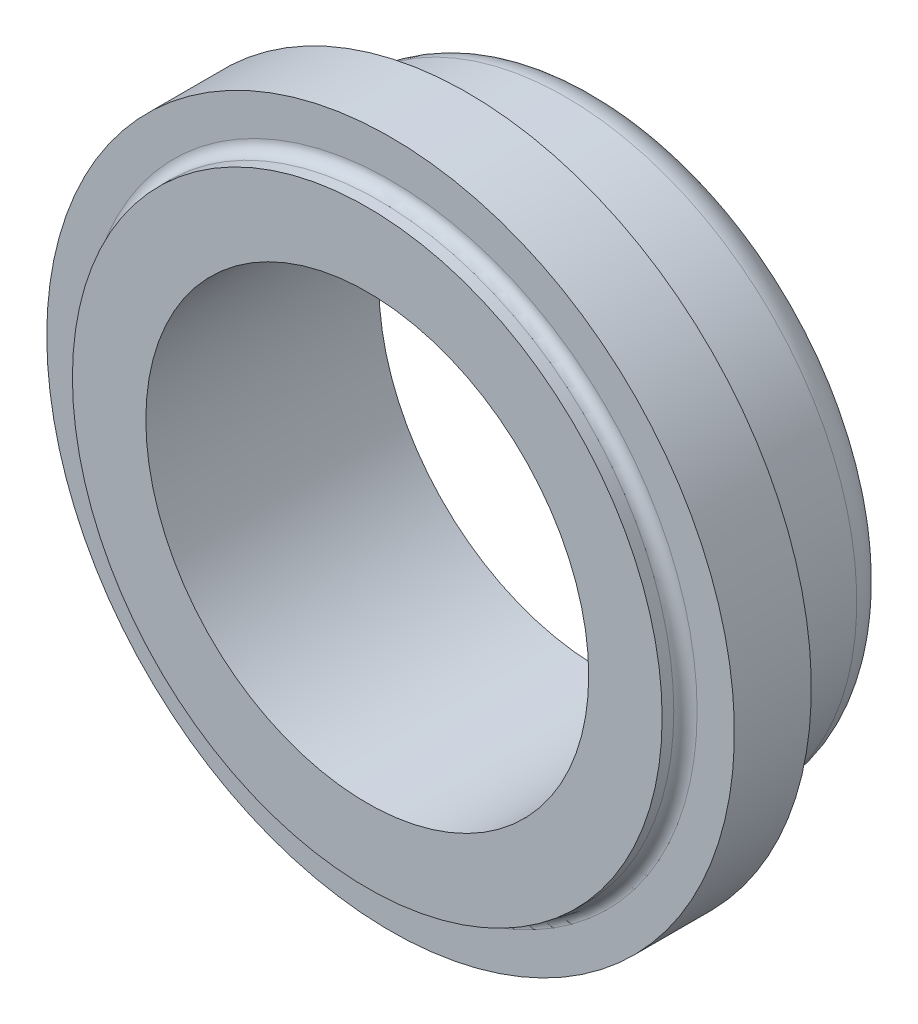
ISO-10303-21;
HEADER;
FILE_DESCRIPTION(('STEP AP214'),'2;1');
FILE_NAME('part.step','',(''),(''),'','','');
FILE_SCHEMA(('AUTOMOTIVE_DESIGN { 1 0 10303 214 1 1 1 1 }'));
ENDSEC;
DATA;
#1=APPLICATION_CONTEXT('core data for automotive mechanical design processes');
#2=APPLICATION_PROTOCOL_DEFINITION('international standard','automotive_design',2000,#1);
#3=PRODUCT_CONTEXT('',#1,'mechanical');
#4=PRODUCT('Part','Part','',(#3));
#5=PRODUCT_RELATED_PRODUCT_CATEGORY('part','',(#4));
#6=PRODUCT_DEFINITION_FORMATION('','',#4);
#7=PRODUCT_DEFINITION_CONTEXT('part definition',#1,'design');
#8=PRODUCT_DEFINITION('design','',#6,#7);
#9=PRODUCT_DEFINITION_SHAPE('','',#8);
#10=(LENGTH_UNIT() NAMED_UNIT(*) SI_UNIT(.MILLI.,.METRE.));
#11=(NAMED_UNIT(*) PLANE_ANGLE_UNIT() SI_UNIT($,.RADIAN.));
#12=(NAMED_UNIT(*) SI_UNIT($,.STERADIAN.) SOLID_ANGLE_UNIT());
#13=UNCERTAINTY_MEASURE_WITH_UNIT(LENGTH_MEASURE(1.E-05),#10,'distance_accuracy_value','');
#14=(GEOMETRIC_REPRESENTATION_CONTEXT(3) GLOBAL_UNCERTAINTY_ASSIGNED_CONTEXT((#13)) GLOBAL_UNIT_ASSIGNED_CONTEXT((#10,
#11,#12)) REPRESENTATION_CONTEXT('',''));
#15=CARTESIAN_POINT('',(0.,0.,0.));
#16=DIRECTION('',(0.,0.,1.));
#17=DIRECTION('',(1.,0.,0.));
#18=AXIS2_PLACEMENT_3D('',#15,#16,#17);
#19=CARTESIAN_POINT('',(0.,0.,-30.3635490013403));
#20=DIRECTION('',(0.,0.,-1.));
#21=DIRECTION('',(-1.,0.,0.));
#22=AXIS2_PLACEMENT_3D('',#19,#20,#21);
#23=CYLINDRICAL_SURFACE('',#22,27.4999999999755);
#24=CARTESIAN_POINT('',(0.,0.,-6.59999999999999));
#25=DIRECTION('',(0.,0.,-1.));
#26=DIRECTION('',(-1.,0.,0.));
#27=AXIS2_PLACEMENT_3D('',#24,#25,#26);
#28=CIRCLE('',#27,27.4999999999755);
#29=CARTESIAN_POINT('',(-27.4999999999755,0.,-6.59999999999999));
#30=VERTEX_POINT('',#29);
#31=EDGE_CURVE('E98',#30,#30,#28,.T.);
#32=ORIENTED_EDGE('',*,*,#31,.T.);
#33=EDGE_LOOP('',(#32));
#34=FACE_BOUND('',#33,.T.);
#35=CARTESIAN_POINT('',(0.,0.,-1.99999999999999));
#36=DIRECTION('',(0.,0.,-1.));
#37=DIRECTION('',(-1.,0.,0.));
#38=AXIS2_PLACEMENT_3D('',#35,#36,#37);
#39=CIRCLE('',#38,27.4999999999755);
#40=CARTESIAN_POINT('',(-27.4999999999755,0.,-1.99999999999999));
#41=VERTEX_POINT('',#40);
#42=EDGE_CURVE('E125',#41,#41,#39,.T.);
#43=ORIENTED_EDGE('',*,*,#42,.F.);
#44=EDGE_LOOP('',(#43));
#45=FACE_BOUND('',#44,.T.);
#46=ADVANCED_FACE('F31',(#34,#45),#23,.F.);
#47=CARTESIAN_POINT('',(-27.4999999999755,0.,-6.59999999999999));
#48=DIRECTION('',(0.,0.,-1.));
#49=DIRECTION('',(-1.,0.,0.));
#50=AXIS2_PLACEMENT_3D('',#47,#48,#49);
#51=PLANE('',#50);
#52=CARTESIAN_POINT('',(0.,0.,-6.59999999999999));
#53=DIRECTION('',(0.,0.,-1.));
#54=DIRECTION('',(-1.,0.,0.));
#55=AXIS2_PLACEMENT_3D('',#52,#53,#54);
#56=CIRCLE('',#55,29.4999999999755);
#57=CARTESIAN_POINT('',(-29.4999999999755,0.,-6.59999999999999));
#58=VERTEX_POINT('',#57);
#59=EDGE_CURVE('E101',#58,#58,#56,.T.);
#60=ORIENTED_EDGE('',*,*,#59,.T.);
#61=EDGE_LOOP('',(#60));
#62=FACE_BOUND('',#61,.T.);
#63=ORIENTED_EDGE('',*,*,#31,.F.);
#64=EDGE_LOOP('',(#63));
#65=FACE_BOUND('',#64,.T.);
#66=ADVANCED_FACE('F176',(#62,#65),#51,.T.);
#67=CARTESIAN_POINT('',(0.,0.,-30.3635490013403));
#68=DIRECTION('',(0.,0.,-1.));
#69=DIRECTION('',(-1.,0.,0.));
#70=AXIS2_PLACEMENT_3D('',#67,#68,#69);
#71=CYLINDRICAL_SURFACE('',#70,29.4999999999755);
#72=CARTESIAN_POINT('',(0.,0.,0.));
#73=DIRECTION('',(0.,0.,-1.));
#74=DIRECTION('',(-1.,0.,0.));
#75=AXIS2_PLACEMENT_3D('',#72,#73,#74);
#76=CIRCLE('',#75,29.4999999999755);
#77=CARTESIAN_POINT('',(-29.4999999999755,0.,0.));
#78=VERTEX_POINT('',#77);
#79=EDGE_CURVE('E104',#78,#78,#76,.T.);
#80=ORIENTED_EDGE('',*,*,#79,.T.);
#81=EDGE_LOOP('',(#80));
#82=FACE_BOUND('',#81,.T.);
#83=ORIENTED_EDGE('',*,*,#59,.F.);
#84=EDGE_LOOP('',(#83));
#85=FACE_BOUND('',#84,.T.);
#86=ADVANCED_FACE('F172',(#82,#85),#71,.T.);
#87=CARTESIAN_POINT('',(-29.4999999999755,0.,0.));
#88=DIRECTION('',(0.,0.,1.));
#89=DIRECTION('',(1.,0.,0.));
#90=AXIS2_PLACEMENT_3D('',#87,#88,#89);
#91=PLANE('',#90);
#92=CARTESIAN_POINT('',(0.,0.,0.));
#93=DIRECTION('',(0.,0.,1.));
#94=DIRECTION('',(1.,0.,0.));
#95=AXIS2_PLACEMENT_3D('',#92,#93,#94);
#96=CIRCLE('',#95,26.3);
#97=CARTESIAN_POINT('',(26.3,0.,0.));
#98=VERTEX_POINT('',#97);
#99=EDGE_CURVE('E89',#98,#98,#96,.F.);
#100=ORIENTED_EDGE('',*,*,#99,.T.);
#101=EDGE_LOOP('',(#100));
#102=FACE_BOUND('',#101,.T.);
#103=ORIENTED_EDGE('',*,*,#79,.F.);
#104=EDGE_LOOP('',(#103));
#105=FACE_BOUND('',#104,.T.);
#106=ADVANCED_FACE('F166',(#102,#105),#91,.T.);
#107=CARTESIAN_POINT('',(0.,0.,-30.3635490013403));
#108=DIRECTION('',(0.,0.,-1.));
#109=DIRECTION('',(-1.,0.,0.));
#110=AXIS2_PLACEMENT_3D('',#107,#108,#109);
#111=CYLINDRICAL_SURFACE('',#110,25.3);
#112=CARTESIAN_POINT('',(0.,0.,1.));
#113=DIRECTION('',(0.,0.,1.));
#114=DIRECTION('',(1.,0.,0.));
#115=AXIS2_PLACEMENT_3D('',#112,#113,#114);
#116=CIRCLE('',#115,25.3);
#117=CARTESIAN_POINT('',(25.3,0.,1.));
#118=VERTEX_POINT('',#117);
#119=EDGE_CURVE('E48',#118,#118,#116,.T.);
#120=ORIENTED_EDGE('',*,*,#119,.T.);
#121=EDGE_LOOP('',(#120));
#122=FACE_BOUND('',#121,.T.);
#123=CARTESIAN_POINT('',(0.,0.,2.));
#124=DIRECTION('',(0.,0.,-1.));
#125=DIRECTION('',(-1.,0.,0.));
#126=AXIS2_PLACEMENT_3D('',#123,#124,#125);
#127=CIRCLE('',#126,25.3);
#128=CARTESIAN_POINT('',(-25.3,0.,2.));
#129=VERTEX_POINT('',#128);
#130=EDGE_CURVE('E107',#129,#129,#127,.T.);
#131=ORIENTED_EDGE('',*,*,#130,.T.);
#132=EDGE_LOOP('',(#131));
#133=FACE_BOUND('',#132,.T.);
#134=ADVANCED_FACE('F161',(#122,#133),#111,.T.);
#135=CARTESIAN_POINT('',(-25.3,0.,2.));
#136=DIRECTION('',(0.,0.,1.));
#137=DIRECTION('',(1.,0.,0.));
#138=AXIS2_PLACEMENT_3D('',#135,#136,#137);
#139=PLANE('',#138);
#140=CARTESIAN_POINT('',(0.,0.,2.));
#141=DIRECTION('',(0.,0.,-1.));
#142=DIRECTION('',(-1.,0.,0.));
#143=AXIS2_PLACEMENT_3D('',#140,#141,#142);
#144=CIRCLE('',#143,19.);
#145=CARTESIAN_POINT('',(-19.,0.,2.));
#146=VERTEX_POINT('',#145);
#147=EDGE_CURVE('E110',#146,#146,#144,.T.);
#148=ORIENTED_EDGE('',*,*,#147,.T.);
#149=EDGE_LOOP('',(#148));
#150=FACE_BOUND('',#149,.T.);
#151=ORIENTED_EDGE('',*,*,#130,.F.);
#152=EDGE_LOOP('',(#151));
#153=FACE_BOUND('',#152,.T.);
#154=ADVANCED_FACE('F151',(#150,#153),#139,.T.);
#155=CARTESIAN_POINT('',(0.,0.,-30.3635490013403));
#156=DIRECTION('',(0.,0.,-1.));
#157=DIRECTION('',(-1.,0.,0.));
#158=AXIS2_PLACEMENT_3D('',#155,#156,#157);
#159=CYLINDRICAL_SURFACE('',#158,19.);
#160=CARTESIAN_POINT('',(-15.967883483095,10.2969265837094,-12.));
#161=CARTESIAN_POINT('',(-15.967881916616,10.2969298668971,-12.0813197966075));
#162=CARTESIAN_POINT('',(-15.9641558182073,10.3027143599333,-12.1626955371633));
#163=CARTESIAN_POINT('',(-15.9493113042306,10.3256790887199,-12.32319714642));
#164=CARTESIAN_POINT('',(-15.9381844283619,10.3428723665273,-12.4023203320077));
#165=CARTESIAN_POINT('',(-15.9087577656127,10.3880772715907,-12.5559688934397));
#166=CARTESIAN_POINT('',(-15.8904619418191,10.4160829215025,-12.6304967833225));
#167=CARTESIAN_POINT('',(-15.8470656086862,10.4819874436069,-12.7728752117287));
#168=CARTESIAN_POINT('',(-15.8219665921212,10.5198841454113,-12.840727210647));
#169=CARTESIAN_POINT('',(-15.7654216428636,10.6044360678505,-12.9679937298768));
#170=CARTESIAN_POINT('',(-15.7339635814034,10.651108013662,-13.0273917510943));
#171=CARTESIAN_POINT('',(-15.6654047354843,10.7516878155228,-13.1359226417305));
#172=CARTESIAN_POINT('',(-15.6283037087803,10.805595982202,-13.1850550702457));
#173=CARTESIAN_POINT('',(-15.5492532123602,10.9190431268457,-13.2717137606404));
#174=CARTESIAN_POINT('',(-15.507297939511,10.9785888285734,-13.3092259297008));
#175=CARTESIAN_POINT('',(-15.4195907273394,11.1014373804178,-13.3714891072637));
#176=CARTESIAN_POINT('',(-15.3738388449488,11.1647401741914,-13.3962403070821));
#177=CARTESIAN_POINT('',(-15.2798107961916,11.2930817085242,-13.4322319587133));
#178=CARTESIAN_POINT('',(-15.2315397664526,11.3581167937044,-13.4434988623419));
#179=CARTESIAN_POINT('',(-15.1337087091304,11.4881451547233,-13.4522838373348));
#180=CARTESIAN_POINT('',(-15.0841487020537,11.5531384312104,-13.4498021272938));
#181=CARTESIAN_POINT('',(-14.9852689830745,11.6811061249739,-13.4311820192727));
#182=CARTESIAN_POINT('',(-14.9359489856984,11.7440844642008,-13.415072068507));
#183=CARTESIAN_POINT('',(-14.8389233289715,11.8664423966289,-13.3696969824677));
#184=CARTESIAN_POINT('',(-14.7912176828671,11.9258219603041,-13.3404317392783));
#185=CARTESIAN_POINT('',(-14.6988583543093,12.0394741017158,-13.2695449083726));
#186=CARTESIAN_POINT('',(-14.6542078916438,12.0937413136768,-13.2279105245489));
#187=CARTESIAN_POINT('',(-14.5694525298544,12.1957146615459,-13.1334765549064));
#188=CARTESIAN_POINT('',(-14.5293477078318,12.2434206861687,-13.0806767797483));
#189=CARTESIAN_POINT('',(-14.4549223277456,12.3312022115726,-12.9652503654495));
#190=CARTESIAN_POINT('',(-14.4206167761723,12.3712579497845,-12.9025990177821));
#191=CARTESIAN_POINT('',(-14.359095110211,12.4426128434461,-12.7693341754881));
#192=CARTESIAN_POINT('',(-14.3318790003924,12.4739119932519,-12.6987206757297));
#193=CARTESIAN_POINT('',(-14.285495583112,12.5270054288874,-12.5515191705893));
#194=CARTESIAN_POINT('',(-14.2663290511161,12.548798798974,-12.4749305904329));
#195=CARTESIAN_POINT('',(-14.236742114154,12.582355853323,-12.3179609042479));
#196=CARTESIAN_POINT('',(-14.226321555308,12.594119714048,-12.2375798649713));
#197=CARTESIAN_POINT('',(-14.2146236282408,12.6073214562252,-12.0755238658623));
#198=CARTESIAN_POINT('',(-14.2133232815711,12.6087852887119,-11.9938526778685));
#199=CARTESIAN_POINT('',(-14.2198527084505,12.6014210399129,-11.8313441446113));
#200=CARTESIAN_POINT('',(-14.2276824107636,12.5925930389279,-11.7505067928471));
#201=CARTESIAN_POINT('',(-14.252169903627,12.5648713038884,-11.5920592823396));
#202=CARTESIAN_POINT('',(-14.2688170833561,12.545989668085,-11.5144453653681));
#203=CARTESIAN_POINT('',(-14.3103323273523,12.4986149199044,-11.3645316328447));
#204=CARTESIAN_POINT('',(-14.3352005025271,12.4701216778589,-11.2922318890014));
#205=CARTESIAN_POINT('',(-14.3923362977672,12.4041346802022,-11.1548404397041));
#206=CARTESIAN_POINT('',(-14.4246185819238,12.3666230805402,-11.0897634032479));
#207=CARTESIAN_POINT('',(-14.4954394109412,12.28353403243,-10.9688127437803));
#208=CARTESIAN_POINT('',(-14.5339780462784,12.2379564673347,-10.91293925389));
#209=CARTESIAN_POINT('',(-14.6161025239401,12.1397547200352,-10.8118642054467));
#210=CARTESIAN_POINT('',(-14.6596986905198,12.0871160881597,-10.7666850701721));
#211=CARTESIAN_POINT('',(-14.7504458841901,11.9762044660993,-10.6884348985039));
#212=CARTESIAN_POINT('',(-14.7975968807117,11.9179315243645,-10.6553637580038));
#213=CARTESIAN_POINT('',(-14.8939076004991,11.7973496601309,-10.6023070377707));
#214=CARTESIAN_POINT('',(-14.9430651168797,11.7350451298782,-10.5823074723612));
#215=CARTESIAN_POINT('',(-15.0419361789297,11.6080415831231,-10.5559158844363));
#216=CARTESIAN_POINT('',(-15.0916497159282,11.543342603925,-10.5495236500157));
#217=CARTESIAN_POINT('',(-15.1900548542482,11.4135380283631,-10.5505304775193));
#218=CARTESIAN_POINT('',(-15.2387487310775,11.3484338827186,-10.5578945414391));
#219=CARTESIAN_POINT('',(-15.3338994262066,11.2195342281063,-10.5861320962635));
#220=CARTESIAN_POINT('',(-15.380356241093,11.1557387211354,-10.607005607781));
#221=CARTESIAN_POINT('',(-15.4698200821228,11.0313435752398,-10.6616609722967));
#222=CARTESIAN_POINT('',(-15.5128272329753,10.9707438208124,-10.6954423584068));
#223=CARTESIAN_POINT('',(-15.5943406486424,10.8545650289585,-10.7749503210999));
#224=CARTESIAN_POINT('',(-15.6328470013044,10.7989858935434,-10.820676664483));
#225=CARTESIAN_POINT('',(-15.7045622588945,10.6944266070027,-10.9229075587547));
#226=CARTESIAN_POINT('',(-15.7377581473129,10.6454627148152,-10.9794378696241));
#227=CARTESIAN_POINT('',(-15.7980236181691,10.555821879394,-11.1016283958613));
#228=CARTESIAN_POINT('',(-15.8250917094484,10.5151469534648,-11.1672908272077));
#229=CARTESIAN_POINT('',(-15.8725664920665,10.4433468990315,-11.3059895350375));
#230=CARTESIAN_POINT('',(-15.8929622086861,10.4122375089176,-11.3790377038633));
#231=CARTESIAN_POINT('',(-15.9266025648588,10.3607087832219,-11.5302967742438));
#232=CARTESIAN_POINT('',(-15.9398554832227,10.3402770725872,-11.6085015804736));
#233=CARTESIAN_POINT('',(-15.9555576803724,10.3160214385106,-11.7393118455151));
#234=CARTESIAN_POINT('',(-15.9601754395152,10.3088715540402,-11.7910743503267));
#235=CARTESIAN_POINT('',(-15.9663388422443,10.2993230739764,-11.8952168271779));
#236=CARTESIAN_POINT('',(-15.9678844925481,10.2969244679939,-11.9475967978671));
#237=CARTESIAN_POINT('',(-15.967883483095,10.2969265837094,-12.));
#238=B_SPLINE_CURVE_WITH_KNOTS('',3,(#160,#161,#162,#163,#164,#165,#166,#167,#168,#169,#170,
#171,#172,#173,#174,#175,#176,#177,#178,#179,#180,#181,#182,#183,#184,#185,#186,#187,#188,#189,
#190,#191,#192,#193,#194,#195,#196,#197,#198,#199,#200,#201,#202,#203,#204,#205,#206,#207,#208,
#209,#210,#211,#212,#213,#214,#215,#216,#217,#218,#219,#220,#221,#222,#223,#224,#225,#226,#227,
#228,#229,#230,#231,#232,#233,#234,#235,#236,#237),.UNSPECIFIED.,.T.,.F.,(4,2,2,2,2,2,2,2,2,2,2,
2,2,2,2,2,2,2,2,2,2,2,2,2,2,2,2,2,2,2,2,2,2,2,2,2,2,2,4),(0.,0.243768067098826,
0.487815281080648,0.73172777252236,0.97558678731331,1.21991538527472,1.46425447490756,
1.70888874434759,1.95351934605885,2.1976692711454,2.44181531440823,2.68545298786288,
2.92909265996635,3.17298526479476,3.41688200581144,3.66140051392787,3.90591917964655,
4.15046139596882,4.39499930963902,4.63892088601219,4.88284055923233,5.12646736781575,
5.37009746325466,5.61421363993959,5.85833334723612,6.10296046376085,6.34758547689326,
6.59194832794621,6.8363073735394,7.08004558106523,7.32378416048916,7.56751392452686,
7.81123893061218,8.05555247016427,8.29992539803244,8.54469827283305,8.78918683187101,
8.94627349168499,9.10335980801425),.UNSPECIFIED.);
#239=CARTESIAN_POINT('',(-15.967883483095,10.2969265837094,-12.));
#240=VERTEX_POINT('',#239);
#241=EDGE_CURVE('E35',#240,#240,#238,.T.);
#242=ORIENTED_EDGE('',*,*,#241,.F.);
#243=EDGE_LOOP('',(#242));
#244=FACE_BOUND('',#243,.T.);
#245=CARTESIAN_POINT('',(15.967883483095,-10.2969265837094,-12.));
#246=CARTESIAN_POINT('',(15.967881916616,-10.2969298668971,-12.0813197966075));
#247=CARTESIAN_POINT('',(15.9641558182072,-10.3027143599333,-12.1626955371633));
#248=CARTESIAN_POINT('',(15.9493113042306,-10.3256790887199,-12.32319714642));
#249=CARTESIAN_POINT('',(15.9381844283619,-10.3428723665273,-12.4023203320077));
#250=CARTESIAN_POINT('',(15.9087577656127,-10.3880772715907,-12.5559688934397));
#251=CARTESIAN_POINT('',(15.8904619418191,-10.4160829215025,-12.6304967833225));
#252=CARTESIAN_POINT('',(15.8470656086862,-10.4819874436069,-12.7728752117287));
#253=CARTESIAN_POINT('',(15.8219665921212,-10.5198841454113,-12.840727210647));
#254=CARTESIAN_POINT('',(15.7654216428636,-10.6044360678505,-12.9679937298768));
#255=CARTESIAN_POINT('',(15.7339635814034,-10.651108013662,-13.0273917510943));
#256=CARTESIAN_POINT('',(15.6654047354843,-10.7516878155228,-13.1359226417305));
#257=CARTESIAN_POINT('',(15.6283037087803,-10.805595982202,-13.1850550702457));
#258=CARTESIAN_POINT('',(15.5492532123602,-10.9190431268457,-13.2717137606404));
#259=CARTESIAN_POINT('',(15.507297939511,-10.9785888285734,-13.3092259297008));
#260=CARTESIAN_POINT('',(15.4195907273394,-11.1014373804178,-13.3714891072637));
#261=CARTESIAN_POINT('',(15.3738388449488,-11.1647401741914,-13.3962403070821));
#262=CARTESIAN_POINT('',(15.2798107961916,-11.2930817085242,-13.4322319587133));
#263=CARTESIAN_POINT('',(15.2315397664526,-11.3581167937044,-13.4434988623419));
#264=CARTESIAN_POINT('',(15.1337087091304,-11.4881451547233,-13.4522838373348));
#265=CARTESIAN_POINT('',(15.0841487020537,-11.5531384312104,-13.4498021272938));
#266=CARTESIAN_POINT('',(14.9852689830745,-11.6811061249739,-13.4311820192727));
#267=CARTESIAN_POINT('',(14.9359489856984,-11.7440844642008,-13.415072068507));
#268=CARTESIAN_POINT('',(14.8389233289715,-11.8664423966289,-13.3696969824677));
#269=CARTESIAN_POINT('',(14.7912176828671,-11.9258219603041,-13.3404317392783));
#270=CARTESIAN_POINT('',(14.6988583543093,-12.0394741017158,-13.2695449083726));
#271=CARTESIAN_POINT('',(14.6542078916438,-12.0937413136768,-13.2279105245489));
#272=CARTESIAN_POINT('',(14.5694525298544,-12.1957146615459,-13.1334765549064));
#273=CARTESIAN_POINT('',(14.5293477078318,-12.2434206861687,-13.0806767797483));
#274=CARTESIAN_POINT('',(14.4549223277456,-12.3312022115726,-12.9652503654495));
#275=CARTESIAN_POINT('',(14.4206167761723,-12.3712579497845,-12.9025990177821));
#276=CARTESIAN_POINT('',(14.359095110211,-12.4426128434461,-12.7693341754881));
#277=CARTESIAN_POINT('',(14.3318790003924,-12.4739119932519,-12.6987206757297));
#278=CARTESIAN_POINT('',(14.285495583112,-12.5270054288874,-12.5515191705893));
#279=CARTESIAN_POINT('',(14.2663290511161,-12.548798798974,-12.4749305904329));
#280=CARTESIAN_POINT('',(14.236742114154,-12.582355853323,-12.3179609042479));
#281=CARTESIAN_POINT('',(14.226321555308,-12.594119714048,-12.2375798649713));
#282=CARTESIAN_POINT('',(14.2146236282408,-12.6073214562252,-12.0755238658623));
#283=CARTESIAN_POINT('',(14.2133232815711,-12.6087852887119,-11.9938526778685));
#284=CARTESIAN_POINT('',(14.2198527084505,-12.6014210399129,-11.8313441446113));
#285=CARTESIAN_POINT('',(14.2276824107636,-12.5925930389279,-11.7505067928471));
#286=CARTESIAN_POINT('',(14.252169903627,-12.5648713038884,-11.5920592823396));
#287=CARTESIAN_POINT('',(14.2688170833561,-12.545989668085,-11.5144453653681));
#288=CARTESIAN_POINT('',(14.3103323273523,-12.4986149199044,-11.3645316328447));
#289=CARTESIAN_POINT('',(14.3352005025271,-12.4701216778589,-11.2922318890014));
#290=CARTESIAN_POINT('',(14.3923362977672,-12.4041346802022,-11.1548404397041));
#291=CARTESIAN_POINT('',(14.4246185819238,-12.3666230805402,-11.0897634032479));
#292=CARTESIAN_POINT('',(14.4954394109412,-12.28353403243,-10.9688127437803));
#293=CARTESIAN_POINT('',(14.5339780462784,-12.2379564673347,-10.91293925389));
#294=CARTESIAN_POINT('',(14.6161025239402,-12.1397547200352,-10.8118642054467));
#295=CARTESIAN_POINT('',(14.6596986905198,-12.0871160881597,-10.7666850701721));
#296=CARTESIAN_POINT('',(14.7504458841901,-11.9762044660993,-10.6884348985039));
#297=CARTESIAN_POINT('',(14.7975968807117,-11.9179315243645,-10.6553637580038));
#298=CARTESIAN_POINT('',(14.8939076004991,-11.7973496601309,-10.6023070377707));
#299=CARTESIAN_POINT('',(14.9430651168797,-11.7350451298782,-10.5823074723612));
#300=CARTESIAN_POINT('',(15.0419361789297,-11.6080415831231,-10.5559158844363));
#301=CARTESIAN_POINT('',(15.0916497159282,-11.543342603925,-10.5495236500157));
#302=CARTESIAN_POINT('',(15.1900548542482,-11.4135380283631,-10.5505304775193));
#303=CARTESIAN_POINT('',(15.2387487310775,-11.3484338827186,-10.5578945414391));
#304=CARTESIAN_POINT('',(15.3338994262066,-11.2195342281063,-10.5861320962635));
#305=CARTESIAN_POINT('',(15.380356241093,-11.1557387211354,-10.607005607781));
#306=CARTESIAN_POINT('',(15.4698200821228,-11.0313435752398,-10.6616609722967));
#307=CARTESIAN_POINT('',(15.5128272329753,-10.9707438208125,-10.6954423584068));
#308=CARTESIAN_POINT('',(15.5943406486424,-10.8545650289585,-10.7749503210999));
#309=CARTESIAN_POINT('',(15.6328470013044,-10.7989858935434,-10.820676664483));
#310=CARTESIAN_POINT('',(15.7045622588945,-10.6944266070027,-10.9229075587547));
#311=CARTESIAN_POINT('',(15.7377581473129,-10.6454627148152,-10.9794378696241));
#312=CARTESIAN_POINT('',(15.7980236181691,-10.555821879394,-11.1016283958613));
#313=CARTESIAN_POINT('',(15.8250917094484,-10.5151469534648,-11.1672908272077));
#314=CARTESIAN_POINT('',(15.8725664920665,-10.4433468990315,-11.3059895350375));
#315=CARTESIAN_POINT('',(15.8929622086861,-10.4122375089176,-11.3790377038633));
#316=CARTESIAN_POINT('',(15.9266025648588,-10.3607087832219,-11.5302967742438));
#317=CARTESIAN_POINT('',(15.9398554832227,-10.3402770725872,-11.6085015804736));
#318=CARTESIAN_POINT('',(15.9555576803724,-10.3160214385106,-11.7393118455151));
#319=CARTESIAN_POINT('',(15.9601754395152,-10.3088715540402,-11.7910743503267));
#320=CARTESIAN_POINT('',(15.9663388422443,-10.2993230739764,-11.8952168271779));
#321=CARTESIAN_POINT('',(15.9678844925481,-10.296924467994,-11.9475967978671));
#322=CARTESIAN_POINT('',(15.967883483095,-10.2969265837094,-12.));
#323=B_SPLINE_CURVE_WITH_KNOTS('',3,(#245,#246,#247,#248,#249,#250,#251,#252,#253,#254,#255,
#256,#257,#258,#259,#260,#261,#262,#263,#264,#265,#266,#267,#268,#269,#270,#271,#272,#273,#274,
#275,#276,#277,#278,#279,#280,#281,#282,#283,#284,#285,#286,#287,#288,#289,#290,#291,#292,#293,
#294,#295,#296,#297,#298,#299,#300,#301,#302,#303,#304,#305,#306,#307,#308,#309,#310,#311,#312,
#313,#314,#315,#316,#317,#318,#319,#320,#321,#322),.UNSPECIFIED.,.T.,.F.,(4,2,2,2,2,2,2,2,2,2,2,
2,2,2,2,2,2,2,2,2,2,2,2,2,2,2,2,2,2,2,2,2,2,2,2,2,2,2,4),(0.,0.243768067098826,
0.487815281080648,0.731727772522361,0.975586787313309,1.21991538527472,1.46425447490756,
1.70888874434759,1.95351934605885,2.1976692711454,2.44181531440822,2.68545298786288,
2.92909265996635,3.17298526479476,3.41688200581144,3.66140051392787,3.90591917964655,
4.15046139596882,4.39499930963903,4.63892088601219,4.88284055923233,5.12646736781574,
5.37009746325466,5.61421363993959,5.85833334723612,6.10296046376085,6.34758547689326,
6.59194832794621,6.8363073735394,7.08004558106523,7.32378416048916,7.56751392452686,
7.81123893061218,8.05555247016427,8.29992539803244,8.54469827283305,8.78918683187101,
8.946273491685,9.10335980801426),.UNSPECIFIED.);
#324=CARTESIAN_POINT('',(15.967883483095,-10.2969265837094,-12.));
#325=VERTEX_POINT('',#324);
#326=EDGE_CURVE('E56',#325,#325,#323,.T.);
#327=ORIENTED_EDGE('',*,*,#326,.F.);
#328=EDGE_LOOP('',(#327));
#329=FACE_BOUND('',#328,.T.);
#330=CARTESIAN_POINT('',(0.,0.,-18.));
#331=DIRECTION('',(0.,0.,-1.));
#332=DIRECTION('',(-1.,0.,0.));
#333=AXIS2_PLACEMENT_3D('',#330,#331,#332);
#334=CIRCLE('',#333,19.);
#335=CARTESIAN_POINT('',(-19.,0.,-18.));
#336=VERTEX_POINT('',#335);
#337=EDGE_CURVE('E113',#336,#336,#334,.T.);
#338=ORIENTED_EDGE('',*,*,#337,.T.);
#339=EDGE_LOOP('',(#338));
#340=FACE_BOUND('',#339,.T.);
#341=ORIENTED_EDGE('',*,*,#147,.F.);
#342=EDGE_LOOP('',(#341));
#343=FACE_BOUND('',#342,.T.);
#344=ADVANCED_FACE('F147',(#244,#329,#340,#343),#159,.F.);
#345=CARTESIAN_POINT('',(-25.,0.,-18.));
#346=DIRECTION('',(0.,0.,-1.));
#347=DIRECTION('',(-1.,0.,0.));
#348=AXIS2_PLACEMENT_3D('',#345,#346,#347);
#349=PLANE('',#348);
#350=CARTESIAN_POINT('',(0.,0.,-18.));
#351=DIRECTION('',(0.,0.,-1.));
#352=DIRECTION('',(-1.,0.,0.));
#353=AXIS2_PLACEMENT_3D('',#350,#351,#352);
#354=CIRCLE('',#353,22.);
#355=CARTESIAN_POINT('',(-22.,0.,-18.));
#356=VERTEX_POINT('',#355);
#357=EDGE_CURVE('E95',#356,#356,#354,.T.);
#358=ORIENTED_EDGE('',*,*,#357,.T.);
#359=EDGE_LOOP('',(#358));
#360=FACE_BOUND('',#359,.T.);
#361=ORIENTED_EDGE('',*,*,#337,.F.);
#362=EDGE_LOOP('',(#361));
#363=FACE_BOUND('',#362,.T.);
#364=ADVANCED_FACE('F150',(#360,#363),#349,.T.);
#365=CARTESIAN_POINT('',(0.,0.,-30.3635490013403));
#366=DIRECTION('',(0.,0.,-1.));
#367=DIRECTION('',(-1.,0.,0.));
#368=AXIS2_PLACEMENT_3D('',#365,#366,#367);
#369=CYLINDRICAL_SURFACE('',#368,25.);
#370=CARTESIAN_POINT('',(-21.4566509142662,12.830125936378,-12.));
#371=CARTESIAN_POINT('',(-21.456648479426,12.8301324068711,-11.8460334742107));
#372=CARTESIAN_POINT('',(-21.4499604137448,12.8413354411991,-11.691967223286));
#373=CARTESIAN_POINT('',(-21.4232879295678,12.885782089449,-11.3881122849433));
#374=CARTESIAN_POINT('',(-21.4032891413681,12.9190495230447,-11.2383284030518));
#375=CARTESIAN_POINT('',(-21.3503043710183,13.0064252420786,-10.947482118355));
#376=CARTESIAN_POINT('',(-21.3173266132735,13.0605203291522,-10.8064142578218));
#377=CARTESIAN_POINT('',(-21.2389056733454,13.1876623428049,-10.536887836688));
#378=CARTESIAN_POINT('',(-21.1934648376223,13.2607057017972,-10.4084269087188));
#379=CARTESIAN_POINT('',(-21.0906617743319,13.4236087280982,-10.1671708750565));
#380=CARTESIAN_POINT('',(-21.0332538378751,13.5135327368554,-10.0544386854091));
#381=CARTESIAN_POINT('',(-20.907651255668,13.7070565284622,-9.8483826279982));
#382=CARTESIAN_POINT('',(-20.8394561008728,13.8106569566586,-9.75505967663079));
#383=CARTESIAN_POINT('',(-20.6934417131243,14.0284953139963,-9.59025019006623));
#384=CARTESIAN_POINT('',(-20.6155984099343,14.1427596648903,-9.51881987788121));
#385=CARTESIAN_POINT('',(-20.4521505563526,14.3781097967555,-9.40018314189491));
#386=CARTESIAN_POINT('',(-20.3665462320397,14.4991953789853,-9.35297601273823));
#387=CARTESIAN_POINT('',(-20.1900429074051,14.7439760948014,-9.28431168967596));
#388=CARTESIAN_POINT('',(-20.0991668485347,14.8676586172874,-9.26275058520353));
#389=CARTESIAN_POINT('',(-19.9142462752758,15.1144488834158,-9.24566863989002));
#390=CARTESIAN_POINT('',(-19.8202018590327,15.2375566447282,-9.25014699316677));
#391=CARTESIAN_POINT('',(-19.6320812399236,15.4791710234442,-9.28493289422161));
#392=CARTESIAN_POINT('',(-19.5380069319148,15.5976952305408,-9.31512870143252));
#393=CARTESIAN_POINT('',(-19.3522975597562,15.8275210224682,-9.40031806181733));
#394=CARTESIAN_POINT('',(-19.2606625329343,15.938822496808,-9.45531199424248));
#395=CARTESIAN_POINT('',(-19.0825872392561,16.1515997049229,-9.58865766438794));
#396=CARTESIAN_POINT('',(-18.9961583409238,16.2530542115756,-9.66705844063213));
#397=CARTESIAN_POINT('',(-18.8316069919219,16.4434313783892,-9.84495666002601));
#398=CARTESIAN_POINT('',(-18.7534848364461,16.5323535932309,-9.94445485253142));
#399=CARTESIAN_POINT('',(-18.60789175695,16.6960610495043,-10.1623509911625));
#400=CARTESIAN_POINT('',(-18.5404794142169,16.7707689521318,-10.2808462105067));
#401=CARTESIAN_POINT('',(-18.4192834330898,16.9037901436027,-10.533036668786));
#402=CARTESIAN_POINT('',(-18.3654998219237,16.9621033996925,-10.6667319380876));
#403=CARTESIAN_POINT('',(-18.2735998919419,17.0610706464034,-10.9456063723868));
#404=CARTESIAN_POINT('',(-18.2354880036524,17.1017196433761,-11.090788771078));
#405=CARTESIAN_POINT('',(-18.1764612824319,17.1644436847077,-11.3884764189584));
#406=CARTESIAN_POINT('',(-18.1555458126712,17.1865194168853,-11.5409813967515));
#407=CARTESIAN_POINT('',(-18.1318189790517,17.2115496629776,-11.8481314903371));
#408=CARTESIAN_POINT('',(-18.1289135311738,17.2146035470792,-12.0027612476764));
#409=CARTESIAN_POINT('',(-18.1410732369196,17.2017887665938,-12.3105204344665));
#410=CARTESIAN_POINT('',(-18.1561380956485,17.1859204125231,-12.463649888496));
#411=CARTESIAN_POINT('',(-18.2035693158119,17.1356715819348,-12.7636610195003));
#412=CARTESIAN_POINT('',(-18.2358911286364,17.1013387695259,-12.9105577369072));
#413=CARTESIAN_POINT('',(-18.3165389895549,17.0149308460672,-13.194402173429));
#414=CARTESIAN_POINT('',(-18.3648654782787,16.9628552465339,-13.3313496185005));
#415=CARTESIAN_POINT('',(-18.4759128542978,16.8418345428228,-13.5920264079986));
#416=CARTESIAN_POINT('',(-18.5386920821446,16.772820989452,-13.7156991168936));
#417=CARTESIAN_POINT('',(-18.6762156578724,16.619553018942,-13.9457401736405));
#418=CARTESIAN_POINT('',(-18.7509603647492,16.5352981445131,-14.0521080021072));
#419=CARTESIAN_POINT('',(-18.9101087590361,16.3530565192018,-14.2449922860278));
#420=CARTESIAN_POINT('',(-18.9945533166128,16.2550112423061,-14.3314197570255));
#421=CARTESIAN_POINT('',(-19.1699223843448,16.0478182696691,-14.4813563811211));
#422=CARTESIAN_POINT('',(-19.2608467896962,15.9386707534813,-14.5448659047895));
#423=CARTESIAN_POINT('',(-19.4459669294362,15.7122782352435,-14.6470144817944));
#424=CARTESIAN_POINT('',(-19.5401552552411,15.5950510418754,-14.6857064102487));
#425=CARTESIAN_POINT('',(-19.7290171420877,15.3554271326361,-14.7372938449572));
#426=CARTESIAN_POINT('',(-19.8236906863093,15.2330305949102,-14.7501902394347));
#427=CARTESIAN_POINT('',(-20.0102123307028,14.987164160726,-14.7498065151387));
#428=CARTESIAN_POINT('',(-20.1020727052107,14.8637033377819,-14.7366641823419));
#429=CARTESIAN_POINT('',(-20.2809729370225,14.6186579085348,-14.6848660785415));
#430=CARTESIAN_POINT('',(-20.3680127929038,14.4970733027855,-14.6462103000086));
#431=CARTESIAN_POINT('',(-20.5350737508152,14.2594478913758,-14.5445227414869));
#432=CARTESIAN_POINT('',(-20.6150962927318,14.1434059506483,-14.4814959766198));
#433=CARTESIAN_POINT('',(-20.7663345632337,13.9203995704075,-14.332869951249));
#434=CARTESIAN_POINT('',(-20.8375502842095,13.8134351387374,-14.247270671242));
#435=CARTESIAN_POINT('',(-20.970067312131,13.6114278792577,-14.0554149050991));
#436=CARTESIAN_POINT('',(-21.0313164491949,13.5164483330104,-13.9490557510531));
#437=CARTESIAN_POINT('',(-21.1423393402269,13.3421212002255,-13.7189074271392));
#438=CARTESIAN_POINT('',(-21.192110351766,13.2627773501284,-13.5951141031413));
#439=CARTESIAN_POINT('',(-21.2794444171952,13.1222001125341,-13.3331928098224));
#440=CARTESIAN_POINT('',(-21.3169701161269,13.061022191317,-13.1950226430791));
#441=CARTESIAN_POINT('',(-21.3789732731209,12.9592856090123,-12.9086568027197));
#442=CARTESIAN_POINT('',(-21.4034652539158,12.9187040009665,-12.7604724957379));
#443=CARTESIAN_POINT('',(-21.4330401957152,12.8695485278465,-12.5095625373151));
#444=CARTESIAN_POINT('',(-21.4418870263144,12.8547895526253,-12.4084335233056));
#445=CARTESIAN_POINT('',(-21.4536931799818,12.8350761301519,-12.2048843905453));
#446=CARTESIAN_POINT('',(-21.4566525346453,12.8301216302836,-12.1024642787262));
#447=CARTESIAN_POINT('',(-21.4566509142662,12.830125936378,-12.));
#448=B_SPLINE_CURVE_WITH_KNOTS('',3,(#370,#371,#372,#373,#374,#375,#376,#377,#378,#379,#380,
#381,#382,#383,#384,#385,#386,#387,#388,#389,#390,#391,#392,#393,#394,#395,#396,#397,#398,#399,
#400,#401,#402,#403,#404,#405,#406,#407,#408,#409,#410,#411,#412,#413,#414,#415,#416,#417,#418,
#419,#420,#421,#422,#423,#424,#425,#426,#427,#428,#429,#430,#431,#432,#433,#434,#435,#436,#437,
#438,#439,#440,#441,#442,#443,#444,#445,#446,#447),.UNSPECIFIED.,.T.,.F.,(4,2,2,2,2,2,2,2,2,2,2,
2,2,2,2,2,2,2,2,2,2,2,2,2,2,2,2,2,2,2,2,2,2,2,2,2,2,2,4),(0.,0.461525346649217,0.92354974681717,
1.3852818453785,1.84692707188869,2.31036898789318,2.7738327800779,3.23847701983118,
3.70310772883058,4.16584940002148,4.62857675012777,5.08930377879792,5.55003785385672,
6.0117440458019,6.47346663976293,6.93763376137262,7.40180181030171,7.86610099332299,
8.33038298132154,8.79223751061133,9.25408446091611,9.71474488321557,10.1754179891605,
10.6379843269411,11.1005645455327,11.5651707506207,12.0297694429502,12.4933749676283,
12.956964528604,13.4181075202701,13.879250648027,14.3402989310724,14.8013476124794,
15.2647369838843,15.7282369568759,16.1931379223798,16.6575197847123,16.9646652197374,
17.2718090064523),.UNSPECIFIED.);
#449=CARTESIAN_POINT('',(-21.4566509142662,12.830125936378,-12.));
#450=VERTEX_POINT('',#449);
#451=EDGE_CURVE('E10',#450,#450,#448,.T.);
#452=ORIENTED_EDGE('',*,*,#451,.F.);
#453=EDGE_LOOP('',(#452));
#454=FACE_BOUND('',#453,.T.);
#455=CARTESIAN_POINT('',(21.4566509142662,-12.830125936378,-12.));
#456=CARTESIAN_POINT('',(21.456648479426,-12.8301324068711,-11.8460334742107));
#457=CARTESIAN_POINT('',(21.4499604137448,-12.8413354411991,-11.691967223286));
#458=CARTESIAN_POINT('',(21.4232879295678,-12.885782089449,-11.3881122849433));
#459=CARTESIAN_POINT('',(21.4032891413681,-12.9190495230447,-11.2383284030518));
#460=CARTESIAN_POINT('',(21.3503043710183,-13.0064252420786,-10.947482118355));
#461=CARTESIAN_POINT('',(21.3173266132735,-13.0605203291522,-10.8064142578218));
#462=CARTESIAN_POINT('',(21.2389056733454,-13.1876623428049,-10.536887836688));
#463=CARTESIAN_POINT('',(21.1934648376223,-13.2607057017972,-10.4084269087188));
#464=CARTESIAN_POINT('',(21.0906617743319,-13.4236087280982,-10.1671708750565));
#465=CARTESIAN_POINT('',(21.0332538378751,-13.5135327368554,-10.0544386854091));
#466=CARTESIAN_POINT('',(20.907651255668,-13.7070565284622,-9.8483826279982));
#467=CARTESIAN_POINT('',(20.8394561008728,-13.8106569566586,-9.75505967663079));
#468=CARTESIAN_POINT('',(20.6934417131243,-14.0284953139963,-9.59025019006623));
#469=CARTESIAN_POINT('',(20.6155984099343,-14.1427596648903,-9.51881987788121));
#470=CARTESIAN_POINT('',(20.4521505563526,-14.3781097967555,-9.40018314189491));
#471=CARTESIAN_POINT('',(20.3665462320397,-14.4991953789853,-9.35297601273823));
#472=CARTESIAN_POINT('',(20.1900429074051,-14.7439760948014,-9.28431168967596));
#473=CARTESIAN_POINT('',(20.0991668485347,-14.8676586172874,-9.26275058520353));
#474=CARTESIAN_POINT('',(19.9142462752758,-15.1144488834158,-9.24566863989002));
#475=CARTESIAN_POINT('',(19.8202018590327,-15.2375566447282,-9.25014699316677));
#476=CARTESIAN_POINT('',(19.6320812399236,-15.4791710234442,-9.28493289422161));
#477=CARTESIAN_POINT('',(19.5380069319148,-15.5976952305408,-9.31512870143252));
#478=CARTESIAN_POINT('',(19.3522975597562,-15.8275210224682,-9.40031806181733));
#479=CARTESIAN_POINT('',(19.2606625329343,-15.938822496808,-9.45531199424248));
#480=CARTESIAN_POINT('',(19.0825872392561,-16.1515997049229,-9.58865766438794));
#481=CARTESIAN_POINT('',(18.9961583409238,-16.2530542115756,-9.66705844063213));
#482=CARTESIAN_POINT('',(18.8316069919219,-16.4434313783892,-9.84495666002601));
#483=CARTESIAN_POINT('',(18.7534848364461,-16.532353593231,-9.94445485253142));
#484=CARTESIAN_POINT('',(18.60789175695,-16.6960610495043,-10.1623509911625));
#485=CARTESIAN_POINT('',(18.5404794142169,-16.7707689521318,-10.2808462105067));
#486=CARTESIAN_POINT('',(18.4192834330898,-16.9037901436027,-10.533036668786));
#487=CARTESIAN_POINT('',(18.3654998219237,-16.9621033996925,-10.6667319380876));
#488=CARTESIAN_POINT('',(18.2735998919419,-17.0610706464034,-10.9456063723868));
#489=CARTESIAN_POINT('',(18.2354880036524,-17.1017196433761,-11.090788771078));
#490=CARTESIAN_POINT('',(18.1764612824319,-17.1644436847077,-11.3884764189584));
#491=CARTESIAN_POINT('',(18.1555458126712,-17.1865194168853,-11.5409813967515));
#492=CARTESIAN_POINT('',(18.1318189790517,-17.2115496629776,-11.8481314903371));
#493=CARTESIAN_POINT('',(18.1289135311738,-17.2146035470792,-12.0027612476763));
#494=CARTESIAN_POINT('',(18.1410732369196,-17.2017887665938,-12.3105204344665));
#495=CARTESIAN_POINT('',(18.1561380956484,-17.1859204125231,-12.463649888496));
#496=CARTESIAN_POINT('',(18.2035693158119,-17.1356715819348,-12.7636610195003));
#497=CARTESIAN_POINT('',(18.2358911286364,-17.1013387695259,-12.9105577369072));
#498=CARTESIAN_POINT('',(18.3165389895549,-17.0149308460672,-13.194402173429));
#499=CARTESIAN_POINT('',(18.3648654782787,-16.9628552465339,-13.3313496185005));
#500=CARTESIAN_POINT('',(18.4759128542978,-16.8418345428228,-13.5920264079986));
#501=CARTESIAN_POINT('',(18.5386920821446,-16.772820989452,-13.7156991168936));
#502=CARTESIAN_POINT('',(18.6762156578724,-16.619553018942,-13.9457401736405));
#503=CARTESIAN_POINT('',(18.7509603647492,-16.5352981445131,-14.0521080021072));
#504=CARTESIAN_POINT('',(18.9101087590361,-16.3530565192018,-14.2449922860278));
#505=CARTESIAN_POINT('',(18.9945533166128,-16.2550112423061,-14.3314197570255));
#506=CARTESIAN_POINT('',(19.1699223843448,-16.0478182696691,-14.4813563811211));
#507=CARTESIAN_POINT('',(19.2608467896962,-15.9386707534813,-14.5448659047895));
#508=CARTESIAN_POINT('',(19.4459669294362,-15.7122782352435,-14.6470144817944));
#509=CARTESIAN_POINT('',(19.5401552552411,-15.5950510418754,-14.6857064102487));
#510=CARTESIAN_POINT('',(19.7290171420877,-15.3554271326361,-14.7372938449572));
#511=CARTESIAN_POINT('',(19.8236906863093,-15.2330305949102,-14.7501902394347));
#512=CARTESIAN_POINT('',(20.0102123307028,-14.987164160726,-14.7498065151387));
#513=CARTESIAN_POINT('',(20.1020727052107,-14.8637033377819,-14.7366641823419));
#514=CARTESIAN_POINT('',(20.2809729370225,-14.6186579085348,-14.6848660785415));
#515=CARTESIAN_POINT('',(20.3680127929038,-14.4970733027855,-14.6462103000086));
#516=CARTESIAN_POINT('',(20.5350737508152,-14.2594478913758,-14.5445227414869));
#517=CARTESIAN_POINT('',(20.6150962927318,-14.1434059506483,-14.4814959766198));
#518=CARTESIAN_POINT('',(20.7663345632337,-13.9203995704075,-14.332869951249));
#519=CARTESIAN_POINT('',(20.8375502842095,-13.8134351387374,-14.247270671242));
#520=CARTESIAN_POINT('',(20.970067312131,-13.6114278792577,-14.0554149050991));
#521=CARTESIAN_POINT('',(21.0313164491949,-13.5164483330104,-13.9490557510531));
#522=CARTESIAN_POINT('',(21.1423393402269,-13.3421212002255,-13.7189074271392));
#523=CARTESIAN_POINT('',(21.192110351766,-13.2627773501284,-13.5951141031413));
#524=CARTESIAN_POINT('',(21.2794444171952,-13.1222001125341,-13.3331928098224));
#525=CARTESIAN_POINT('',(21.3169701161269,-13.0610221913169,-13.1950226430791));
#526=CARTESIAN_POINT('',(21.3789732731209,-12.9592856090123,-12.9086568027197));
#527=CARTESIAN_POINT('',(21.4034652539158,-12.9187040009665,-12.7604724957379));
#528=CARTESIAN_POINT('',(21.4330401957152,-12.8695485278465,-12.5095625373151));
#529=CARTESIAN_POINT('',(21.4418870263144,-12.8547895526253,-12.4084335233056));
#530=CARTESIAN_POINT('',(21.4536931799818,-12.8350761301519,-12.2048843905453));
#531=CARTESIAN_POINT('',(21.4566525346453,-12.8301216302836,-12.1024642787262));
#532=CARTESIAN_POINT('',(21.4566509142662,-12.830125936378,-12.));
#533=B_SPLINE_CURVE_WITH_KNOTS('',3,(#455,#456,#457,#458,#459,#460,#461,#462,#463,#464,#465,
#466,#467,#468,#469,#470,#471,#472,#473,#474,#475,#476,#477,#478,#479,#480,#481,#482,#483,#484,
#485,#486,#487,#488,#489,#490,#491,#492,#493,#494,#495,#496,#497,#498,#499,#500,#501,#502,#503,
#504,#505,#506,#507,#508,#509,#510,#511,#512,#513,#514,#515,#516,#517,#518,#519,#520,#521,#522,
#523,#524,#525,#526,#527,#528,#529,#530,#531,#532),.UNSPECIFIED.,.T.,.F.,(4,2,2,2,2,2,2,2,2,2,2,
2,2,2,2,2,2,2,2,2,2,2,2,2,2,2,2,2,2,2,2,2,2,2,2,2,2,2,4),(0.,0.461525346649217,0.92354974681717,
1.3852818453785,1.84692707188869,2.31036898789318,2.7738327800779,3.23847701983118,
3.70310772883058,4.16584940002148,4.62857675012777,5.08930377879792,5.55003785385672,
6.0117440458019,6.47346663976293,6.93763376137262,7.40180181030171,7.86610099332299,
8.33038298132154,8.79223751061133,9.2540844609161,9.71474488321557,10.1754179891605,
10.6379843269411,11.1005645455327,11.5651707506207,12.0297694429502,12.4933749676283,
12.956964528604,13.41810752027,13.8792506480269,14.3402989310724,14.8013476124794,
15.2647369838843,15.7282369568759,16.1931379223798,16.6575197847123,16.9646652197374,
17.2718090064523),.UNSPECIFIED.);
#534=CARTESIAN_POINT('',(21.4566509142662,-12.830125936378,-12.));
#535=VERTEX_POINT('',#534);
#536=EDGE_CURVE('E44',#535,#535,#533,.T.);
#537=ORIENTED_EDGE('',*,*,#536,.F.);
#538=EDGE_LOOP('',(#537));
#539=FACE_BOUND('',#538,.T.);
#540=CARTESIAN_POINT('',(0.,0.,-15.));
#541=DIRECTION('',(0.,0.,-1.));
#542=DIRECTION('',(-1.,0.,0.));
#543=AXIS2_PLACEMENT_3D('',#540,#541,#542);
#544=CIRCLE('',#543,25.);
#545=CARTESIAN_POINT('',(-25.,0.,-15.));
#546=VERTEX_POINT('',#545);
#547=EDGE_CURVE('E92',#546,#546,#544,.F.);
#548=ORIENTED_EDGE('',*,*,#547,.T.);
#549=EDGE_LOOP('',(#548));
#550=FACE_BOUND('',#549,.T.);
#551=CARTESIAN_POINT('',(0.,0.,-5.49999999999999));
#552=DIRECTION('',(0.,0.,-1.));
#553=DIRECTION('',(-1.,0.,0.));
#554=AXIS2_PLACEMENT_3D('',#551,#552,#553);
#555=CIRCLE('',#554,25.);
#556=CARTESIAN_POINT('',(-25.,0.,-5.49999999999999));
#557=VERTEX_POINT('',#556);
#558=EDGE_CURVE('E116',#557,#557,#555,.T.);
#559=ORIENTED_EDGE('',*,*,#558,.T.);
#560=EDGE_LOOP('',(#559));
#561=FACE_BOUND('',#560,.T.);
#562=ADVANCED_FACE('F61',(#454,#539,#550,#561),#369,.T.);
#563=CARTESIAN_POINT('',(0.,0.,-5.49999999999999));
#564=DIRECTION('',(0.,0.,-1.));
#565=DIRECTION('',(-1.,0.,0.));
#566=AXIS2_PLACEMENT_3D('',#563,#564,#565);
#567=CONICAL_SURFACE('',#566,25.,0.785398163403573);
#568=CARTESIAN_POINT('',(0.,0.,-3.49999999999999));
#569=DIRECTION('',(0.,0.,-1.));
#570=DIRECTION('',(-1.,0.,0.));
#571=AXIS2_PLACEMENT_3D('',#568,#569,#570);
#572=CIRCLE('',#571,22.9999999999755);
#573=CARTESIAN_POINT('',(-22.9999999999755,0.,-3.49999999999999));
#574=VERTEX_POINT('',#573);
#575=EDGE_CURVE('E119',#574,#574,#572,.T.);
#576=ORIENTED_EDGE('',*,*,#575,.T.);
#577=EDGE_LOOP('',(#576));
#578=FACE_BOUND('',#577,.T.);
#579=ORIENTED_EDGE('',*,*,#558,.F.);
#580=EDGE_LOOP('',(#579));
#581=FACE_BOUND('',#580,.T.);
#582=ADVANCED_FACE('F208',(#578,#581),#567,.T.);
#583=CARTESIAN_POINT('',(0.,0.,-30.3635490013403));
#584=DIRECTION('',(0.,0.,-1.));
#585=DIRECTION('',(-1.,0.,0.));
#586=AXIS2_PLACEMENT_3D('',#583,#584,#585);
#587=CYLINDRICAL_SURFACE('',#586,22.9999999999755);
#588=CARTESIAN_POINT('',(0.,0.,-1.99999999999999));
#589=DIRECTION('',(0.,0.,-1.));
#590=DIRECTION('',(-1.,0.,0.));
#591=AXIS2_PLACEMENT_3D('',#588,#589,#590);
#592=CIRCLE('',#591,22.9999999999755);
#593=CARTESIAN_POINT('',(-22.9999999999755,0.,-1.99999999999999));
#594=VERTEX_POINT('',#593);
#595=EDGE_CURVE('E122',#594,#594,#592,.T.);
#596=ORIENTED_EDGE('',*,*,#595,.T.);
#597=EDGE_LOOP('',(#596));
#598=FACE_BOUND('',#597,.T.);
#599=ORIENTED_EDGE('',*,*,#575,.F.);
#600=EDGE_LOOP('',(#599));
#601=FACE_BOUND('',#600,.T.);
#602=ADVANCED_FACE('F196',(#598,#601),#587,.T.);
#603=CARTESIAN_POINT('',(-27.4999999999755,0.,-1.99999999999999));
#604=DIRECTION('',(0.,0.,-1.));
#605=DIRECTION('',(-1.,0.,0.));
#606=AXIS2_PLACEMENT_3D('',#603,#604,#605);
#607=PLANE('',#606);
#608=ORIENTED_EDGE('',*,*,#42,.T.);
#609=EDGE_LOOP('',(#608));
#610=FACE_BOUND('',#609,.T.);
#611=ORIENTED_EDGE('',*,*,#595,.F.);
#612=EDGE_LOOP('',(#611));
#613=FACE_BOUND('',#612,.T.);
#614=ADVANCED_FACE('F188',(#610,#613),#607,.T.);
#615=CARTESIAN_POINT('',(0.,0.,-15.));
#616=DIRECTION('',(0.,0.,-1.));
#617=DIRECTION('',(-1.,0.,0.));
#618=AXIS2_PLACEMENT_3D('',#615,#616,#617);
#619=TOROIDAL_SURFACE('',#618,22.,3.);
#620=ORIENTED_EDGE('',*,*,#547,.F.);
#621=EDGE_LOOP('',(#620));
#622=FACE_BOUND('',#621,.T.);
#623=ORIENTED_EDGE('',*,*,#357,.F.);
#624=EDGE_LOOP('',(#623));
#625=FACE_BOUND('',#624,.T.);
#626=ADVANCED_FACE('F186',(#622,#625),#619,.T.);
#627=CARTESIAN_POINT('',(0.,0.,1.));
#628=DIRECTION('',(0.,0.,1.));
#629=DIRECTION('',(1.,0.,0.));
#630=AXIS2_PLACEMENT_3D('',#627,#628,#629);
#631=TOROIDAL_SURFACE('',#630,26.3,1.);
#632=ORIENTED_EDGE('',*,*,#119,.F.);
#633=EDGE_LOOP('',(#632));
#634=FACE_BOUND('',#633,.T.);
#635=ORIENTED_EDGE('',*,*,#99,.F.);
#636=EDGE_LOOP('',(#635));
#637=FACE_BOUND('',#636,.T.);
#638=ADVANCED_FACE('F33',(#634,#637),#631,.F.);
#639=CARTESIAN_POINT('',(19.9151292458453,-15.1124990362705,-12.));
#640=DIRECTION('',(0.796605169833813,-0.60449996145082,0.));
#641=DIRECTION('',(0.60449996145082,0.796605169833813,0.));
#642=AXIS2_PLACEMENT_3D('',#639,#640,#641);
#643=CYLINDRICAL_SURFACE('',#642,1.45);
#644=ORIENTED_EDGE('',*,*,#326,.T.);
#645=EDGE_LOOP('',(#644));
#646=FACE_BOUND('',#645,.T.);
#647=CARTESIAN_POINT('',(16.3304059815932,-12.3922492097418,-12.));
#648=DIRECTION('',(0.796605169833813,-0.60449996145082,0.));
#649=DIRECTION('',(0.60449996145082,0.796605169833813,0.));
#650=AXIS2_PLACEMENT_3D('',#647,#648,#649);
#651=CIRCLE('',#650,1.45);
#652=CARTESIAN_POINT('',(17.2069309256968,-11.2371717134828,-12.));
#653=VERTEX_POINT('',#652);
#654=EDGE_CURVE('E128',#653,#653,#651,.T.);
#655=ORIENTED_EDGE('',*,*,#654,.T.);
#656=EDGE_LOOP('',(#655));
#657=FACE_BOUND('',#656,.T.);
#658=ADVANCED_FACE('F194',(#646,#657),#643,.F.);
#659=CARTESIAN_POINT('',(16.3304059815932,-12.3922492097418,-10.55));
#660=DIRECTION('',(-0.796605169833813,0.60449996145082,0.));
#661=DIRECTION('',(-0.60449996145082,-0.796605169833813,0.));
#662=AXIS2_PLACEMENT_3D('',#659,#660,#661);
#663=PLANE('',#662);
#664=ORIENTED_EDGE('',*,*,#654,.F.);
#665=EDGE_LOOP('',(#664));
#666=FACE_BOUND('',#665,.T.);
#667=CARTESIAN_POINT('',(16.3304059815932,-12.3922492097418,-12.));
#668=DIRECTION('',(0.796605169833813,-0.60449996145082,0.));
#669=DIRECTION('',(0.60449996145082,0.796605169833813,0.));
#670=AXIS2_PLACEMENT_3D('',#667,#668,#669);
#671=CIRCLE('',#670,2.75);
#672=CARTESIAN_POINT('',(17.9927808755829,-10.2015849926988,-12.));
#673=VERTEX_POINT('',#672);
#674=EDGE_CURVE('E131',#673,#673,#671,.T.);
#675=ORIENTED_EDGE('',*,*,#674,.T.);
#676=EDGE_LOOP('',(#675));
#677=FACE_BOUND('',#676,.T.);
#678=ADVANCED_FACE('F81',(#666,#677),#663,.F.);
#679=CARTESIAN_POINT('',(19.9151292458453,-15.1124990362705,-12.));
#680=DIRECTION('',(0.796605169833813,-0.60449996145082,0.));
#681=DIRECTION('',(0.60449996145082,0.796605169833813,0.));
#682=AXIS2_PLACEMENT_3D('',#679,#680,#681);
#683=CYLINDRICAL_SURFACE('',#682,2.75);
#684=ORIENTED_EDGE('',*,*,#536,.T.);
#685=EDGE_LOOP('',(#684));
#686=FACE_BOUND('',#685,.T.);
#687=ORIENTED_EDGE('',*,*,#674,.F.);
#688=EDGE_LOOP('',(#687));
#689=FACE_BOUND('',#688,.T.);
#690=ADVANCED_FACE('F76',(#686,#689),#683,.F.);
#691=CARTESIAN_POINT('',(-19.9151292458453,15.1124990362705,-12.));
#692=DIRECTION('',(-0.796605169833812,0.60449996145082,0.));
#693=DIRECTION('',(-0.60449996145082,-0.796605169833812,0.));
#694=AXIS2_PLACEMENT_3D('',#691,#692,#693);
#695=CYLINDRICAL_SURFACE('',#694,1.45);
#696=ORIENTED_EDGE('',*,*,#241,.T.);
#697=EDGE_LOOP('',(#696));
#698=FACE_BOUND('',#697,.T.);
#699=CARTESIAN_POINT('',(-16.3304059815932,12.3922492097418,-12.));
#700=DIRECTION('',(-0.796605169833812,0.60449996145082,0.));
#701=DIRECTION('',(-0.60449996145082,-0.796605169833812,0.));
#702=AXIS2_PLACEMENT_3D('',#699,#700,#701);
#703=CIRCLE('',#702,1.45);
#704=CARTESIAN_POINT('',(-17.2069309256968,11.2371717134828,-12.));
#705=VERTEX_POINT('',#704);
#706=EDGE_CURVE('E134',#705,#705,#703,.T.);
#707=ORIENTED_EDGE('',*,*,#706,.T.);
#708=EDGE_LOOP('',(#707));
#709=FACE_BOUND('',#708,.T.);
#710=ADVANCED_FACE('F71',(#698,#709),#695,.F.);
#711=CARTESIAN_POINT('',(-16.3304059815932,12.3922492097418,-10.55));
#712=DIRECTION('',(0.796605169833812,-0.60449996145082,0.));
#713=DIRECTION('',(0.60449996145082,0.796605169833812,0.));
#714=AXIS2_PLACEMENT_3D('',#711,#712,#713);
#715=PLANE('',#714);
#716=ORIENTED_EDGE('',*,*,#706,.F.);
#717=EDGE_LOOP('',(#716));
#718=FACE_BOUND('',#717,.T.);
#719=CARTESIAN_POINT('',(-16.3304059815932,12.3922492097418,-12.));
#720=DIRECTION('',(-0.796605169833812,0.60449996145082,0.));
#721=DIRECTION('',(-0.60449996145082,-0.796605169833812,0.));
#722=AXIS2_PLACEMENT_3D('',#719,#720,#721);
#723=CIRCLE('',#722,2.75);
#724=CARTESIAN_POINT('',(-17.9927808755829,10.2015849926988,-12.));
#725=VERTEX_POINT('',#724);
#726=EDGE_CURVE('E137',#725,#725,#723,.T.);
#727=ORIENTED_EDGE('',*,*,#726,.T.);
#728=EDGE_LOOP('',(#727));
#729=FACE_BOUND('',#728,.T.);
#730=ADVANCED_FACE('F69',(#718,#729),#715,.F.);
#731=CARTESIAN_POINT('',(-19.9151292458453,15.1124990362705,-12.));
#732=DIRECTION('',(-0.796605169833812,0.60449996145082,0.));
#733=DIRECTION('',(-0.60449996145082,-0.796605169833812,0.));
#734=AXIS2_PLACEMENT_3D('',#731,#732,#733);
#735=CYLINDRICAL_SURFACE('',#734,2.75);
#736=ORIENTED_EDGE('',*,*,#451,.T.);
#737=EDGE_LOOP('',(#736));
#738=FACE_BOUND('',#737,.T.);
#739=ORIENTED_EDGE('',*,*,#726,.F.);
#740=EDGE_LOOP('',(#739));
#741=FACE_BOUND('',#740,.T.);
#742=ADVANCED_FACE('F65',(#738,#741),#735,.F.);
#743=CLOSED_SHELL('',(#46,#66,#86,#106,#134,#154,#344,#364,#562,#582,#602,#614,#626,#638,#658,
#678,#690,#710,#730,#742));
#744=MANIFOLD_SOLID_BREP('B2',#743);
#745=ADVANCED_BREP_SHAPE_REPRESENTATION('',(#18,#744),#14);
#746=SHAPE_DEFINITION_REPRESENTATION(#9,#745);
ENDSEC;
END-ISO-10303-21;
